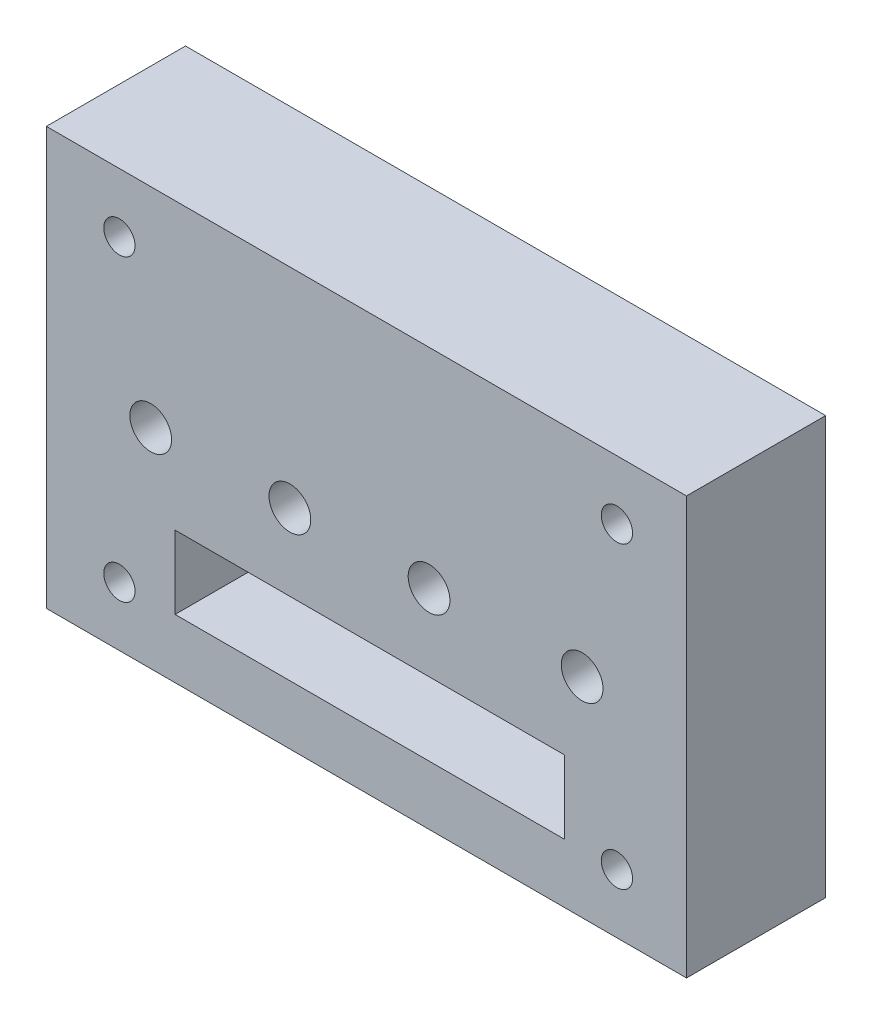
ISO-10303-21;
HEADER;
FILE_DESCRIPTION(('STEP AP214'),'2;1');
FILE_NAME('part.step','',(''),(''),'','','');
FILE_SCHEMA(('AUTOMOTIVE_DESIGN { 1 0 10303 214 1 1 1 1 }'));
ENDSEC;
DATA;
#1=APPLICATION_CONTEXT('core data for automotive mechanical design processes');
#2=APPLICATION_PROTOCOL_DEFINITION('international standard','automotive_design',2000,#1);
#3=PRODUCT_CONTEXT('',#1,'mechanical');
#4=PRODUCT('Part','Part','',(#3));
#5=PRODUCT_RELATED_PRODUCT_CATEGORY('part','',(#4));
#6=PRODUCT_DEFINITION_FORMATION('','',#4);
#7=PRODUCT_DEFINITION_CONTEXT('part definition',#1,'design');
#8=PRODUCT_DEFINITION('design','',#6,#7);
#9=PRODUCT_DEFINITION_SHAPE('','',#8);
#10=(LENGTH_UNIT() NAMED_UNIT(*) SI_UNIT(.MILLI.,.METRE.));
#11=(NAMED_UNIT(*) PLANE_ANGLE_UNIT() SI_UNIT($,.RADIAN.));
#12=(NAMED_UNIT(*) SI_UNIT($,.STERADIAN.) SOLID_ANGLE_UNIT());
#13=UNCERTAINTY_MEASURE_WITH_UNIT(LENGTH_MEASURE(1.E-05),#10,'distance_accuracy_value','');
#14=(GEOMETRIC_REPRESENTATION_CONTEXT(3) GLOBAL_UNCERTAINTY_ASSIGNED_CONTEXT((#13)) GLOBAL_UNIT_ASSIGNED_CONTEXT((#10,
#11,#12)) REPRESENTATION_CONTEXT('',''));
#15=CARTESIAN_POINT('',(0.,0.,0.));
#16=DIRECTION('',(0.,0.,1.));
#17=DIRECTION('',(1.,0.,0.));
#18=AXIS2_PLACEMENT_3D('',#15,#16,#17);
#19=CARTESIAN_POINT('',(0.,0.,20.));
#20=DIRECTION('',(0.,1.,0.));
#21=DIRECTION('',(0.,0.,1.));
#22=AXIS2_PLACEMENT_3D('',#19,#20,#21);
#23=PLANE('',#22);
#24=DIRECTION('',(1.,0.,0.));
#25=VECTOR('',#24,1.);
#26=CARTESIAN_POINT('',(0.,0.,0.));
#27=LINE('',#26,#25);
#28=CARTESIAN_POINT('',(0.,0.,0.));
#29=VERTEX_POINT('',#28);
#30=CARTESIAN_POINT('',(92.,0.,0.));
#31=VERTEX_POINT('',#30);
#32=EDGE_CURVE('E189',#29,#31,#27,.T.);
#33=ORIENTED_EDGE('',*,*,#32,.T.);
#34=DIRECTION('',(0.,0.,-1.));
#35=VECTOR('',#34,1.);
#36=CARTESIAN_POINT('',(92.,0.,20.));
#37=LINE('',#36,#35);
#38=CARTESIAN_POINT('',(92.,0.,20.));
#39=VERTEX_POINT('',#38);
#40=EDGE_CURVE('E11',#39,#31,#37,.T.);
#41=ORIENTED_EDGE('',*,*,#40,.F.);
#42=DIRECTION('',(1.,0.,0.));
#43=VECTOR('',#42,1.);
#44=CARTESIAN_POINT('',(0.,0.,20.));
#45=LINE('',#44,#43);
#46=CARTESIAN_POINT('',(0.,0.,20.));
#47=VERTEX_POINT('',#46);
#48=EDGE_CURVE('E120',#47,#39,#45,.T.);
#49=ORIENTED_EDGE('',*,*,#48,.F.);
#50=DIRECTION('',(0.,0.,-1.));
#51=VECTOR('',#50,1.);
#52=CARTESIAN_POINT('',(0.,0.,20.));
#53=LINE('',#52,#51);
#54=EDGE_CURVE('E59',#47,#29,#53,.T.);
#55=ORIENTED_EDGE('',*,*,#54,.T.);
#56=EDGE_LOOP('',(#33,#41,#49,#55));
#57=FACE_BOUND('',#56,.T.);
#58=ADVANCED_FACE('F39',(#57),#23,.F.);
#59=CARTESIAN_POINT('',(92.,0.,20.));
#60=DIRECTION('',(-1.,0.,0.));
#61=DIRECTION('',(0.,0.,1.));
#62=AXIS2_PLACEMENT_3D('',#59,#60,#61);
#63=PLANE('',#62);
#64=DIRECTION('',(0.,1.,0.));
#65=VECTOR('',#64,1.);
#66=CARTESIAN_POINT('',(92.,0.,0.));
#67=LINE('',#66,#65);
#68=CARTESIAN_POINT('',(92.,60.,0.));
#69=VERTEX_POINT('',#68);
#70=EDGE_CURVE('E127',#31,#69,#67,.T.);
#71=ORIENTED_EDGE('',*,*,#70,.T.);
#72=DIRECTION('',(0.,0.,-1.));
#73=VECTOR('',#72,1.);
#74=CARTESIAN_POINT('',(92.,60.,20.));
#75=LINE('',#74,#73);
#76=CARTESIAN_POINT('',(92.,60.,20.));
#77=VERTEX_POINT('',#76);
#78=EDGE_CURVE('E50',#77,#69,#75,.T.);
#79=ORIENTED_EDGE('',*,*,#78,.F.);
#80=DIRECTION('',(0.,1.,0.));
#81=VECTOR('',#80,1.);
#82=CARTESIAN_POINT('',(92.,0.,20.));
#83=LINE('',#82,#81);
#84=EDGE_CURVE('E114',#39,#77,#83,.T.);
#85=ORIENTED_EDGE('',*,*,#84,.F.);
#86=ORIENTED_EDGE('',*,*,#40,.T.);
#87=EDGE_LOOP('',(#71,#79,#85,#86));
#88=FACE_BOUND('',#87,.T.);
#89=ADVANCED_FACE('F126',(#88),#63,.F.);
#90=CARTESIAN_POINT('',(0.,60.,20.));
#91=DIRECTION('',(0.,1.,0.));
#92=DIRECTION('',(0.,0.,1.));
#93=AXIS2_PLACEMENT_3D('',#90,#91,#92);
#94=PLANE('',#93);
#95=DIRECTION('',(1.,0.,0.));
#96=VECTOR('',#95,1.);
#97=CARTESIAN_POINT('',(0.,60.,0.));
#98=LINE('',#97,#96);
#99=CARTESIAN_POINT('',(0.,60.,0.));
#100=VERTEX_POINT('',#99);
#101=EDGE_CURVE('E194',#100,#69,#98,.T.);
#102=ORIENTED_EDGE('',*,*,#101,.F.);
#103=DIRECTION('',(0.,0.,-1.));
#104=VECTOR('',#103,1.);
#105=CARTESIAN_POINT('',(0.,60.,20.));
#106=LINE('',#105,#104);
#107=CARTESIAN_POINT('',(0.,60.,20.));
#108=VERTEX_POINT('',#107);
#109=EDGE_CURVE('E85',#108,#100,#106,.T.);
#110=ORIENTED_EDGE('',*,*,#109,.F.);
#111=DIRECTION('',(1.,0.,0.));
#112=VECTOR('',#111,1.);
#113=CARTESIAN_POINT('',(0.,60.,20.));
#114=LINE('',#113,#112);
#115=EDGE_CURVE('E119',#108,#77,#114,.T.);
#116=ORIENTED_EDGE('',*,*,#115,.T.);
#117=ORIENTED_EDGE('',*,*,#78,.T.);
#118=EDGE_LOOP('',(#102,#110,#116,#117));
#119=FACE_BOUND('',#118,.T.);
#120=ADVANCED_FACE('F132',(#119),#94,.T.);
#121=CARTESIAN_POINT('',(0.,19.,20.));
#122=DIRECTION('',(0.,1.,0.));
#123=DIRECTION('',(0.,0.,1.));
#124=AXIS2_PLACEMENT_3D('',#121,#122,#123);
#125=PLANE('',#124);
#126=DIRECTION('',(1.,0.,0.));
#127=VECTOR('',#126,1.);
#128=CARTESIAN_POINT('',(0.,19.,0.));
#129=LINE('',#128,#127);
#130=CARTESIAN_POINT('',(18.5,19.,0.));
#131=VERTEX_POINT('',#130);
#132=CARTESIAN_POINT('',(74.5,19.,0.));
#133=VERTEX_POINT('',#132);
#134=EDGE_CURVE('E173',#131,#133,#129,.T.);
#135=ORIENTED_EDGE('',*,*,#134,.T.);
#136=DIRECTION('',(0.,0.,-1.));
#137=VECTOR('',#136,1.);
#138=CARTESIAN_POINT('',(74.5,19.,20.));
#139=LINE('',#138,#137);
#140=CARTESIAN_POINT('',(74.5,19.,20.));
#141=VERTEX_POINT('',#140);
#142=EDGE_CURVE('E43',#141,#133,#139,.T.);
#143=ORIENTED_EDGE('',*,*,#142,.F.);
#144=DIRECTION('',(1.,0.,0.));
#145=VECTOR('',#144,1.);
#146=CARTESIAN_POINT('',(0.,19.,20.));
#147=LINE('',#146,#145);
#148=CARTESIAN_POINT('',(18.5,19.,20.));
#149=VERTEX_POINT('',#148);
#150=EDGE_CURVE('E292',#149,#141,#147,.T.);
#151=ORIENTED_EDGE('',*,*,#150,.F.);
#152=DIRECTION('',(0.,0.,-1.));
#153=VECTOR('',#152,1.);
#154=CARTESIAN_POINT('',(18.5,19.,20.));
#155=LINE('',#154,#153);
#156=EDGE_CURVE('E137',#149,#131,#155,.T.);
#157=ORIENTED_EDGE('',*,*,#156,.T.);
#158=EDGE_LOOP('',(#135,#143,#151,#157));
#159=FACE_BOUND('',#158,.T.);
#160=ADVANCED_FACE('F221',(#159),#125,.F.);
#161=CARTESIAN_POINT('',(74.5,0.,20.));
#162=DIRECTION('',(1.,0.,0.));
#163=DIRECTION('',(0.,1.,0.));
#164=AXIS2_PLACEMENT_3D('',#161,#162,#163);
#165=PLANE('',#164);
#166=DIRECTION('',(0.,-1.,0.));
#167=VECTOR('',#166,1.);
#168=CARTESIAN_POINT('',(74.5,0.,0.));
#169=LINE('',#168,#167);
#170=CARTESIAN_POINT('',(74.5,8.5,0.));
#171=VERTEX_POINT('',#170);
#172=EDGE_CURVE('E177',#133,#171,#169,.T.);
#173=ORIENTED_EDGE('',*,*,#172,.T.);
#174=DIRECTION('',(0.,0.,-1.));
#175=VECTOR('',#174,1.);
#176=CARTESIAN_POINT('',(74.5,8.5,20.));
#177=LINE('',#176,#175);
#178=CARTESIAN_POINT('',(74.5,8.5,20.));
#179=VERTEX_POINT('',#178);
#180=EDGE_CURVE('E210',#179,#171,#177,.T.);
#181=ORIENTED_EDGE('',*,*,#180,.F.);
#182=DIRECTION('',(0.,-1.,0.));
#183=VECTOR('',#182,1.);
#184=CARTESIAN_POINT('',(74.5,0.,20.));
#185=LINE('',#184,#183);
#186=EDGE_CURVE('E98',#141,#179,#185,.T.);
#187=ORIENTED_EDGE('',*,*,#186,.F.);
#188=ORIENTED_EDGE('',*,*,#142,.T.);
#189=EDGE_LOOP('',(#173,#181,#187,#188));
#190=FACE_BOUND('',#189,.T.);
#191=ADVANCED_FACE('F217',(#190),#165,.F.);
#192=CARTESIAN_POINT('',(0.,8.5,20.));
#193=DIRECTION('',(0.,1.,0.));
#194=DIRECTION('',(0.,0.,1.));
#195=AXIS2_PLACEMENT_3D('',#192,#193,#194);
#196=PLANE('',#195);
#197=DIRECTION('',(1.,0.,0.));
#198=VECTOR('',#197,1.);
#199=CARTESIAN_POINT('',(0.,8.5,0.));
#200=LINE('',#199,#198);
#201=CARTESIAN_POINT('',(18.5,8.5,0.));
#202=VERTEX_POINT('',#201);
#203=EDGE_CURVE('E181',#202,#171,#200,.T.);
#204=ORIENTED_EDGE('',*,*,#203,.F.);
#205=DIRECTION('',(0.,0.,-1.));
#206=VECTOR('',#205,1.);
#207=CARTESIAN_POINT('',(18.5,8.5,20.));
#208=LINE('',#207,#206);
#209=CARTESIAN_POINT('',(18.5,8.5,20.));
#210=VERTEX_POINT('',#209);
#211=EDGE_CURVE('E208',#210,#202,#208,.T.);
#212=ORIENTED_EDGE('',*,*,#211,.F.);
#213=DIRECTION('',(1.,0.,0.));
#214=VECTOR('',#213,1.);
#215=CARTESIAN_POINT('',(0.,8.5,20.));
#216=LINE('',#215,#214);
#217=EDGE_CURVE('E297',#210,#179,#216,.T.);
#218=ORIENTED_EDGE('',*,*,#217,.T.);
#219=ORIENTED_EDGE('',*,*,#180,.T.);
#220=EDGE_LOOP('',(#204,#212,#218,#219));
#221=FACE_BOUND('',#220,.T.);
#222=ADVANCED_FACE('F232',(#221),#196,.T.);
#223=CARTESIAN_POINT('',(18.5,0.,20.));
#224=DIRECTION('',(1.,0.,0.));
#225=DIRECTION('',(0.,1.,0.));
#226=AXIS2_PLACEMENT_3D('',#223,#224,#225);
#227=PLANE('',#226);
#228=DIRECTION('',(0.,-1.,0.));
#229=VECTOR('',#228,1.);
#230=CARTESIAN_POINT('',(18.5,0.,0.));
#231=LINE('',#230,#229);
#232=EDGE_CURVE('E185',#131,#202,#231,.T.);
#233=ORIENTED_EDGE('',*,*,#232,.F.);
#234=ORIENTED_EDGE('',*,*,#156,.F.);
#235=DIRECTION('',(0.,-1.,0.));
#236=VECTOR('',#235,1.);
#237=CARTESIAN_POINT('',(18.5,0.,20.));
#238=LINE('',#237,#236);
#239=EDGE_CURVE('E230',#149,#210,#238,.T.);
#240=ORIENTED_EDGE('',*,*,#239,.T.);
#241=ORIENTED_EDGE('',*,*,#211,.T.);
#242=EDGE_LOOP('',(#233,#234,#240,#241));
#243=FACE_BOUND('',#242,.T.);
#244=ADVANCED_FACE('F227',(#243),#227,.T.);
#245=CARTESIAN_POINT('',(15.,30.,20.));
#246=DIRECTION('',(0.,0.,-1.));
#247=DIRECTION('',(-1.,0.,0.));
#248=AXIS2_PLACEMENT_3D('',#245,#246,#247);
#249=CYLINDRICAL_SURFACE('',#248,3.);
#250=CARTESIAN_POINT('',(15.,30.,20.));
#251=DIRECTION('',(0.,0.,1.));
#252=DIRECTION('',(1.,0.,0.));
#253=AXIS2_PLACEMENT_3D('',#250,#251,#252);
#254=CIRCLE('',#253,3.);
#255=CARTESIAN_POINT('',(18.,30.,20.));
#256=VERTEX_POINT('',#255);
#257=EDGE_CURVE('E291',#256,#256,#254,.T.);
#258=ORIENTED_EDGE('',*,*,#257,.T.);
#259=EDGE_LOOP('',(#258));
#260=FACE_BOUND('',#259,.T.);
#261=CARTESIAN_POINT('',(15.,30.,0.));
#262=DIRECTION('',(0.,0.,1.));
#263=DIRECTION('',(1.,0.,0.));
#264=AXIS2_PLACEMENT_3D('',#261,#262,#263);
#265=CIRCLE('',#264,3.);
#266=CARTESIAN_POINT('',(18.,30.,0.));
#267=VERTEX_POINT('',#266);
#268=EDGE_CURVE('E169',#267,#267,#265,.T.);
#269=ORIENTED_EDGE('',*,*,#268,.F.);
#270=EDGE_LOOP('',(#269));
#271=FACE_BOUND('',#270,.T.);
#272=ADVANCED_FACE('F239',(#260,#271),#249,.F.);
#273=CARTESIAN_POINT('',(35.,30.,20.));
#274=DIRECTION('',(0.,0.,-1.));
#275=DIRECTION('',(-1.,0.,0.));
#276=AXIS2_PLACEMENT_3D('',#273,#274,#275);
#277=CYLINDRICAL_SURFACE('',#276,3.);
#278=CARTESIAN_POINT('',(35.,30.,20.));
#279=DIRECTION('',(0.,0.,1.));
#280=DIRECTION('',(1.,0.,0.));
#281=AXIS2_PLACEMENT_3D('',#278,#279,#280);
#282=CIRCLE('',#281,3.);
#283=CARTESIAN_POINT('',(38.,30.,20.));
#284=VERTEX_POINT('',#283);
#285=EDGE_CURVE('E287',#284,#284,#282,.T.);
#286=ORIENTED_EDGE('',*,*,#285,.T.);
#287=EDGE_LOOP('',(#286));
#288=FACE_BOUND('',#287,.T.);
#289=CARTESIAN_POINT('',(35.,30.,0.));
#290=DIRECTION('',(0.,0.,1.));
#291=DIRECTION('',(1.,0.,0.));
#292=AXIS2_PLACEMENT_3D('',#289,#290,#291);
#293=CIRCLE('',#292,3.);
#294=CARTESIAN_POINT('',(38.,30.,0.));
#295=VERTEX_POINT('',#294);
#296=EDGE_CURVE('E165',#295,#295,#293,.T.);
#297=ORIENTED_EDGE('',*,*,#296,.F.);
#298=EDGE_LOOP('',(#297));
#299=FACE_BOUND('',#298,.T.);
#300=ADVANCED_FACE('F340',(#288,#299),#277,.F.);
#301=CARTESIAN_POINT('',(55.,30.,20.));
#302=DIRECTION('',(0.,0.,-1.));
#303=DIRECTION('',(-1.,0.,0.));
#304=AXIS2_PLACEMENT_3D('',#301,#302,#303);
#305=CYLINDRICAL_SURFACE('',#304,3.);
#306=CARTESIAN_POINT('',(55.,30.,20.));
#307=DIRECTION('',(0.,0.,1.));
#308=DIRECTION('',(1.,0.,0.));
#309=AXIS2_PLACEMENT_3D('',#306,#307,#308);
#310=CIRCLE('',#309,3.);
#311=CARTESIAN_POINT('',(58.,30.,20.));
#312=VERTEX_POINT('',#311);
#313=EDGE_CURVE('E283',#312,#312,#310,.T.);
#314=ORIENTED_EDGE('',*,*,#313,.T.);
#315=EDGE_LOOP('',(#314));
#316=FACE_BOUND('',#315,.T.);
#317=CARTESIAN_POINT('',(55.,30.,0.));
#318=DIRECTION('',(0.,0.,1.));
#319=DIRECTION('',(1.,0.,0.));
#320=AXIS2_PLACEMENT_3D('',#317,#318,#319);
#321=CIRCLE('',#320,3.);
#322=CARTESIAN_POINT('',(58.,30.,0.));
#323=VERTEX_POINT('',#322);
#324=EDGE_CURVE('E161',#323,#323,#321,.T.);
#325=ORIENTED_EDGE('',*,*,#324,.F.);
#326=EDGE_LOOP('',(#325));
#327=FACE_BOUND('',#326,.T.);
#328=ADVANCED_FACE('F346',(#316,#327),#305,.F.);
#329=CARTESIAN_POINT('',(77.,30.,20.));
#330=DIRECTION('',(0.,0.,-1.));
#331=DIRECTION('',(-1.,0.,0.));
#332=AXIS2_PLACEMENT_3D('',#329,#330,#331);
#333=CYLINDRICAL_SURFACE('',#332,3.00000000000001);
#334=CARTESIAN_POINT('',(77.,30.,20.));
#335=DIRECTION('',(0.,0.,1.));
#336=DIRECTION('',(1.,0.,0.));
#337=AXIS2_PLACEMENT_3D('',#334,#335,#336);
#338=CIRCLE('',#337,3.00000000000001);
#339=CARTESIAN_POINT('',(80.,30.,20.));
#340=VERTEX_POINT('',#339);
#341=EDGE_CURVE('E279',#340,#340,#338,.T.);
#342=ORIENTED_EDGE('',*,*,#341,.T.);
#343=EDGE_LOOP('',(#342));
#344=FACE_BOUND('',#343,.T.);
#345=CARTESIAN_POINT('',(77.,30.,0.));
#346=DIRECTION('',(0.,0.,1.));
#347=DIRECTION('',(1.,0.,0.));
#348=AXIS2_PLACEMENT_3D('',#345,#346,#347);
#349=CIRCLE('',#348,3.00000000000001);
#350=CARTESIAN_POINT('',(80.,30.,0.));
#351=VERTEX_POINT('',#350);
#352=EDGE_CURVE('E157',#351,#351,#349,.T.);
#353=ORIENTED_EDGE('',*,*,#352,.F.);
#354=EDGE_LOOP('',(#353));
#355=FACE_BOUND('',#354,.T.);
#356=ADVANCED_FACE('F353',(#344,#355),#333,.F.);
#357=CARTESIAN_POINT('',(82.,51.5,20.));
#358=DIRECTION('',(0.,0.,-1.));
#359=DIRECTION('',(-1.,0.,0.));
#360=AXIS2_PLACEMENT_3D('',#357,#358,#359);
#361=CYLINDRICAL_SURFACE('',#360,2.25);
#362=CARTESIAN_POINT('',(82.,51.5,20.));
#363=DIRECTION('',(0.,0.,1.));
#364=DIRECTION('',(1.,0.,0.));
#365=AXIS2_PLACEMENT_3D('',#362,#363,#364);
#366=CIRCLE('',#365,2.25);
#367=CARTESIAN_POINT('',(84.25,51.5,20.));
#368=VERTEX_POINT('',#367);
#369=EDGE_CURVE('E275',#368,#368,#366,.T.);
#370=ORIENTED_EDGE('',*,*,#369,.T.);
#371=EDGE_LOOP('',(#370));
#372=FACE_BOUND('',#371,.T.);
#373=CARTESIAN_POINT('',(82.,51.5,0.));
#374=DIRECTION('',(0.,0.,1.));
#375=DIRECTION('',(1.,0.,0.));
#376=AXIS2_PLACEMENT_3D('',#373,#374,#375);
#377=CIRCLE('',#376,2.25);
#378=CARTESIAN_POINT('',(84.25,51.5,0.));
#379=VERTEX_POINT('',#378);
#380=EDGE_CURVE('E153',#379,#379,#377,.T.);
#381=ORIENTED_EDGE('',*,*,#380,.F.);
#382=EDGE_LOOP('',(#381));
#383=FACE_BOUND('',#382,.T.);
#384=ADVANCED_FACE('F357',(#372,#383),#361,.F.);
#385=CARTESIAN_POINT('',(82.,8.5,20.));
#386=DIRECTION('',(0.,0.,-1.));
#387=DIRECTION('',(-1.,0.,0.));
#388=AXIS2_PLACEMENT_3D('',#385,#386,#387);
#389=CYLINDRICAL_SURFACE('',#388,2.25);
#390=CARTESIAN_POINT('',(82.,8.5,20.));
#391=DIRECTION('',(0.,0.,1.));
#392=DIRECTION('',(1.,0.,0.));
#393=AXIS2_PLACEMENT_3D('',#390,#391,#392);
#394=CIRCLE('',#393,2.25);
#395=CARTESIAN_POINT('',(84.25,8.5,20.));
#396=VERTEX_POINT('',#395);
#397=EDGE_CURVE('E271',#396,#396,#394,.T.);
#398=ORIENTED_EDGE('',*,*,#397,.T.);
#399=EDGE_LOOP('',(#398));
#400=FACE_BOUND('',#399,.T.);
#401=CARTESIAN_POINT('',(82.,8.5,0.));
#402=DIRECTION('',(0.,0.,1.));
#403=DIRECTION('',(1.,0.,0.));
#404=AXIS2_PLACEMENT_3D('',#401,#402,#403);
#405=CIRCLE('',#404,2.25);
#406=CARTESIAN_POINT('',(84.25,8.5,0.));
#407=VERTEX_POINT('',#406);
#408=EDGE_CURVE('E149',#407,#407,#405,.T.);
#409=ORIENTED_EDGE('',*,*,#408,.F.);
#410=EDGE_LOOP('',(#409));
#411=FACE_BOUND('',#410,.T.);
#412=ADVANCED_FACE('F361',(#400,#411),#389,.F.);
#413=CARTESIAN_POINT('',(10.5,8.5,20.));
#414=DIRECTION('',(0.,0.,-1.));
#415=DIRECTION('',(-1.,0.,0.));
#416=AXIS2_PLACEMENT_3D('',#413,#414,#415);
#417=CYLINDRICAL_SURFACE('',#416,2.25);
#418=CARTESIAN_POINT('',(10.5,8.5,20.));
#419=DIRECTION('',(0.,0.,1.));
#420=DIRECTION('',(1.,0.,0.));
#421=AXIS2_PLACEMENT_3D('',#418,#419,#420);
#422=CIRCLE('',#421,2.25);
#423=CARTESIAN_POINT('',(12.75,8.5,20.));
#424=VERTEX_POINT('',#423);
#425=EDGE_CURVE('E267',#424,#424,#422,.T.);
#426=ORIENTED_EDGE('',*,*,#425,.T.);
#427=EDGE_LOOP('',(#426));
#428=FACE_BOUND('',#427,.T.);
#429=CARTESIAN_POINT('',(10.5,8.5,0.));
#430=DIRECTION('',(0.,0.,1.));
#431=DIRECTION('',(1.,0.,0.));
#432=AXIS2_PLACEMENT_3D('',#429,#430,#431);
#433=CIRCLE('',#432,2.25);
#434=CARTESIAN_POINT('',(12.75,8.5,0.));
#435=VERTEX_POINT('',#434);
#436=EDGE_CURVE('E145',#435,#435,#433,.T.);
#437=ORIENTED_EDGE('',*,*,#436,.F.);
#438=EDGE_LOOP('',(#437));
#439=FACE_BOUND('',#438,.T.);
#440=ADVANCED_FACE('F322',(#428,#439),#417,.F.);
#441=CARTESIAN_POINT('',(10.5,51.5,20.));
#442=DIRECTION('',(0.,0.,-1.));
#443=DIRECTION('',(-1.,0.,0.));
#444=AXIS2_PLACEMENT_3D('',#441,#442,#443);
#445=CYLINDRICAL_SURFACE('',#444,2.25);
#446=CARTESIAN_POINT('',(10.5,51.5,20.));
#447=DIRECTION('',(0.,0.,1.));
#448=DIRECTION('',(1.,0.,0.));
#449=AXIS2_PLACEMENT_3D('',#446,#447,#448);
#450=CIRCLE('',#449,2.25);
#451=CARTESIAN_POINT('',(12.75,51.5,20.));
#452=VERTEX_POINT('',#451);
#453=EDGE_CURVE('E201',#452,#452,#450,.T.);
#454=ORIENTED_EDGE('',*,*,#453,.T.);
#455=EDGE_LOOP('',(#454));
#456=FACE_BOUND('',#455,.T.);
#457=CARTESIAN_POINT('',(10.5,51.5,0.));
#458=DIRECTION('',(0.,0.,1.));
#459=DIRECTION('',(1.,0.,0.));
#460=AXIS2_PLACEMENT_3D('',#457,#458,#459);
#461=CIRCLE('',#460,2.25);
#462=CARTESIAN_POINT('',(12.75,51.5,0.));
#463=VERTEX_POINT('',#462);
#464=EDGE_CURVE('E141',#463,#463,#461,.T.);
#465=ORIENTED_EDGE('',*,*,#464,.F.);
#466=EDGE_LOOP('',(#465));
#467=FACE_BOUND('',#466,.T.);
#468=ADVANCED_FACE('F41',(#456,#467),#445,.F.);
#469=CARTESIAN_POINT('',(0.,0.,20.));
#470=DIRECTION('',(-1.,0.,0.));
#471=DIRECTION('',(0.,0.,1.));
#472=AXIS2_PLACEMENT_3D('',#469,#470,#471);
#473=PLANE('',#472);
#474=DIRECTION('',(0.,1.,0.));
#475=VECTOR('',#474,1.);
#476=CARTESIAN_POINT('',(0.,0.,0.));
#477=LINE('',#476,#475);
#478=EDGE_CURVE('E197',#29,#100,#477,.T.);
#479=ORIENTED_EDGE('',*,*,#478,.F.);
#480=ORIENTED_EDGE('',*,*,#54,.F.);
#481=DIRECTION('',(0.,1.,0.));
#482=VECTOR('',#481,1.);
#483=CARTESIAN_POINT('',(0.,0.,20.));
#484=LINE('',#483,#482);
#485=EDGE_CURVE('E134',#47,#108,#484,.T.);
#486=ORIENTED_EDGE('',*,*,#485,.T.);
#487=ORIENTED_EDGE('',*,*,#109,.T.);
#488=EDGE_LOOP('',(#479,#480,#486,#487));
#489=FACE_BOUND('',#488,.T.);
#490=ADVANCED_FACE('F251',(#489),#473,.T.);
#491=CARTESIAN_POINT('',(0.,0.,20.));
#492=DIRECTION('',(0.,0.,1.));
#493=DIRECTION('',(1.,0.,0.));
#494=AXIS2_PLACEMENT_3D('',#491,#492,#493);
#495=PLANE('',#494);
#496=ORIENTED_EDGE('',*,*,#453,.F.);
#497=EDGE_LOOP('',(#496));
#498=FACE_BOUND('',#497,.T.);
#499=ORIENTED_EDGE('',*,*,#425,.F.);
#500=EDGE_LOOP('',(#499));
#501=FACE_BOUND('',#500,.T.);
#502=ORIENTED_EDGE('',*,*,#397,.F.);
#503=EDGE_LOOP('',(#502));
#504=FACE_BOUND('',#503,.T.);
#505=ORIENTED_EDGE('',*,*,#369,.F.);
#506=EDGE_LOOP('',(#505));
#507=FACE_BOUND('',#506,.T.);
#508=ORIENTED_EDGE('',*,*,#341,.F.);
#509=EDGE_LOOP('',(#508));
#510=FACE_BOUND('',#509,.T.);
#511=ORIENTED_EDGE('',*,*,#313,.F.);
#512=EDGE_LOOP('',(#511));
#513=FACE_BOUND('',#512,.T.);
#514=ORIENTED_EDGE('',*,*,#285,.F.);
#515=EDGE_LOOP('',(#514));
#516=FACE_BOUND('',#515,.T.);
#517=ORIENTED_EDGE('',*,*,#257,.F.);
#518=EDGE_LOOP('',(#517));
#519=FACE_BOUND('',#518,.T.);
#520=ORIENTED_EDGE('',*,*,#150,.T.);
#521=ORIENTED_EDGE('',*,*,#186,.T.);
#522=ORIENTED_EDGE('',*,*,#217,.F.);
#523=ORIENTED_EDGE('',*,*,#239,.F.);
#524=EDGE_LOOP('',(#520,#521,#522,#523));
#525=FACE_BOUND('',#524,.T.);
#526=ORIENTED_EDGE('',*,*,#48,.T.);
#527=ORIENTED_EDGE('',*,*,#84,.T.);
#528=ORIENTED_EDGE('',*,*,#115,.F.);
#529=ORIENTED_EDGE('',*,*,#485,.F.);
#530=EDGE_LOOP('',(#526,#527,#528,#529));
#531=FACE_BOUND('',#530,.T.);
#532=ADVANCED_FACE('F116',(#498,#501,#504,#507,#510,#513,#516,#519,#525,#531),#495,.T.);
#533=CARTESIAN_POINT('',(0.,0.,0.));
#534=DIRECTION('',(0.,0.,1.));
#535=DIRECTION('',(1.,0.,0.));
#536=AXIS2_PLACEMENT_3D('',#533,#534,#535);
#537=PLANE('',#536);
#538=ORIENTED_EDGE('',*,*,#464,.T.);
#539=EDGE_LOOP('',(#538));
#540=FACE_BOUND('',#539,.T.);
#541=ORIENTED_EDGE('',*,*,#436,.T.);
#542=EDGE_LOOP('',(#541));
#543=FACE_BOUND('',#542,.T.);
#544=ORIENTED_EDGE('',*,*,#408,.T.);
#545=EDGE_LOOP('',(#544));
#546=FACE_BOUND('',#545,.T.);
#547=ORIENTED_EDGE('',*,*,#380,.T.);
#548=EDGE_LOOP('',(#547));
#549=FACE_BOUND('',#548,.T.);
#550=ORIENTED_EDGE('',*,*,#352,.T.);
#551=EDGE_LOOP('',(#550));
#552=FACE_BOUND('',#551,.T.);
#553=ORIENTED_EDGE('',*,*,#324,.T.);
#554=EDGE_LOOP('',(#553));
#555=FACE_BOUND('',#554,.T.);
#556=ORIENTED_EDGE('',*,*,#296,.T.);
#557=EDGE_LOOP('',(#556));
#558=FACE_BOUND('',#557,.T.);
#559=ORIENTED_EDGE('',*,*,#268,.T.);
#560=EDGE_LOOP('',(#559));
#561=FACE_BOUND('',#560,.T.);
#562=ORIENTED_EDGE('',*,*,#134,.F.);
#563=ORIENTED_EDGE('',*,*,#232,.T.);
#564=ORIENTED_EDGE('',*,*,#203,.T.);
#565=ORIENTED_EDGE('',*,*,#172,.F.);
#566=EDGE_LOOP('',(#562,#563,#564,#565));
#567=FACE_BOUND('',#566,.T.);
#568=ORIENTED_EDGE('',*,*,#32,.F.);
#569=ORIENTED_EDGE('',*,*,#478,.T.);
#570=ORIENTED_EDGE('',*,*,#101,.T.);
#571=ORIENTED_EDGE('',*,*,#70,.F.);
#572=EDGE_LOOP('',(#568,#569,#570,#571));
#573=FACE_BOUND('',#572,.T.);
#574=ADVANCED_FACE('F224',(#540,#543,#546,#549,#552,#555,#558,#561,#567,#573),#537,.F.);
#575=CLOSED_SHELL('',(#58,#89,#120,#160,#191,#222,#244,#272,#300,#328,#356,#384,#412,#440,#468,
#490,#532,#574));
#576=MANIFOLD_SOLID_BREP('B2',#575);
#577=ADVANCED_BREP_SHAPE_REPRESENTATION('',(#18,#576),#14);
#578=SHAPE_DEFINITION_REPRESENTATION(#9,#577);
ENDSEC;
END-ISO-10303-21;
